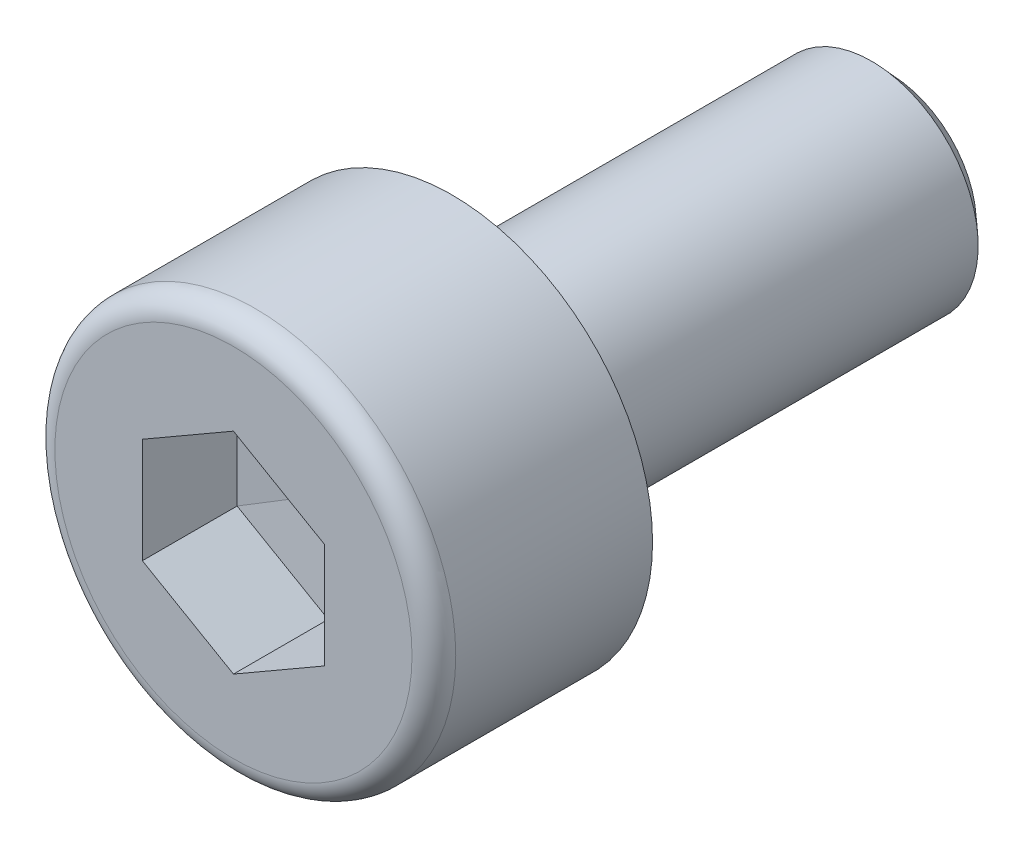
ISO-10303-21;
HEADER;
FILE_DESCRIPTION(('STEP AP214'),'2;1');
FILE_NAME('part.step','',(''),(''),'','','');
FILE_SCHEMA(('AUTOMOTIVE_DESIGN { 1 0 10303 214 1 1 1 1 }'));
ENDSEC;
DATA;
#1=APPLICATION_CONTEXT('core data for automotive mechanical design processes');
#2=APPLICATION_PROTOCOL_DEFINITION('international standard','automotive_design',2000,#1);
#3=PRODUCT_CONTEXT('',#1,'mechanical');
#4=PRODUCT('Part','Part','',(#3));
#5=PRODUCT_RELATED_PRODUCT_CATEGORY('part','',(#4));
#6=PRODUCT_DEFINITION_FORMATION('','',#4);
#7=PRODUCT_DEFINITION_CONTEXT('part definition',#1,'design');
#8=PRODUCT_DEFINITION('design','',#6,#7);
#9=PRODUCT_DEFINITION_SHAPE('','',#8);
#10=(LENGTH_UNIT() NAMED_UNIT(*) SI_UNIT(.MILLI.,.METRE.));
#11=(NAMED_UNIT(*) PLANE_ANGLE_UNIT() SI_UNIT($,.RADIAN.));
#12=(NAMED_UNIT(*) SI_UNIT($,.STERADIAN.) SOLID_ANGLE_UNIT());
#13=UNCERTAINTY_MEASURE_WITH_UNIT(LENGTH_MEASURE(1.E-05),#10,'distance_accuracy_value','');
#14=(GEOMETRIC_REPRESENTATION_CONTEXT(3) GLOBAL_UNCERTAINTY_ASSIGNED_CONTEXT((#13)) GLOBAL_UNIT_ASSIGNED_CONTEXT((#10,
#11,#12)) REPRESENTATION_CONTEXT('',''));
#15=CARTESIAN_POINT('',(0.,0.,0.));
#16=DIRECTION('',(0.,0.,1.));
#17=DIRECTION('',(1.,0.,0.));
#18=AXIS2_PLACEMENT_3D('',#15,#16,#17);
#19=CARTESIAN_POINT('',(-1.5,0.,-1.93470335983093E-13));
#20=DIRECTION('',(0.,0.,-1.));
#21=DIRECTION('',(0.,-1.,0.));
#22=AXIS2_PLACEMENT_3D('',#19,#20,#21);
#23=PLANE('',#22);
#24=CARTESIAN_POINT('',(0.,0.,-1.86517468137026E-13));
#25=DIRECTION('',(0.,0.,-1.));
#26=DIRECTION('',(-1.,0.,0.));
#27=AXIS2_PLACEMENT_3D('',#24,#25,#26);
#28=CIRCLE('',#27,1.4635);
#29=CARTESIAN_POINT('',(-1.46350000000002,0.,-1.93675477230026E-13));
#30=VERTEX_POINT('',#29);
#31=EDGE_CURVE('E11',#30,#30,#28,.T.);
#32=ORIENTED_EDGE('',*,*,#31,.F.);
#33=EDGE_LOOP('',(#32));
#34=FACE_BOUND('',#33,.T.);
#35=CARTESIAN_POINT('',(0.,0.,-3.46180666913291E-13));
#36=DIRECTION('',(0.,0.,-1.));
#37=DIRECTION('',(1.,0.,0.));
#38=AXIS2_PLACEMENT_3D('',#35,#36,#37);
#39=CIRCLE('',#38,2.75);
#40=CARTESIAN_POINT('',(2.74999999999998,0.,-3.33059281286552E-13));
#41=VERTEX_POINT('',#40);
#42=EDGE_CURVE('E116',#41,#41,#39,.T.);
#43=ORIENTED_EDGE('',*,*,#42,.T.);
#44=EDGE_LOOP('',(#43));
#45=FACE_BOUND('',#44,.T.);
#46=ADVANCED_FACE('F17',(#34,#45),#23,.T.);
#47=CARTESIAN_POINT('',(0.,0.,-6.));
#48=DIRECTION('',(0.,0.,-1.));
#49=DIRECTION('',(0.,-1.,0.));
#50=AXIS2_PLACEMENT_3D('',#47,#48,#49);
#51=PLANE('',#50);
#52=CARTESIAN_POINT('',(0.,0.,-6.));
#53=DIRECTION('',(0.,0.,-1.));
#54=DIRECTION('',(-1.,0.,0.));
#55=AXIS2_PLACEMENT_3D('',#52,#53,#54);
#56=CIRCLE('',#55,1.193275);
#57=CARTESIAN_POINT('',(-1.193275,0.,-6.));
#58=VERTEX_POINT('',#57);
#59=EDGE_CURVE('E277',#58,#58,#56,.T.);
#60=ORIENTED_EDGE('',*,*,#59,.T.);
#61=EDGE_LOOP('',(#60));
#62=FACE_BOUND('',#61,.T.);
#63=ADVANCED_FACE('F19',(#62),#51,.T.);
#64=CARTESIAN_POINT('',(0.,0.,-3.00000000000009));
#65=DIRECTION('',(0.,0.,-1.));
#66=DIRECTION('',(-1.,0.,0.));
#67=AXIS2_PLACEMENT_3D('',#64,#65,#66);
#68=CYLINDRICAL_SURFACE('',#67,1.4635);
#69=ORIENTED_EDGE('',*,*,#31,.T.);
#70=EDGE_LOOP('',(#69));
#71=FACE_BOUND('',#70,.T.);
#72=CARTESIAN_POINT('',(0.,0.,-5.75385028398561));
#73=DIRECTION('',(0.,0.,1.));
#74=DIRECTION('',(-1.,0.,0.));
#75=AXIS2_PLACEMENT_3D('',#72,#73,#74);
#76=CIRCLE('',#75,1.4635);
#77=CARTESIAN_POINT('',(-1.46349999999999,0.,-5.75385028398562));
#78=VERTEX_POINT('',#77);
#79=EDGE_CURVE('E283',#78,#78,#76,.T.);
#80=ORIENTED_EDGE('',*,*,#79,.T.);
#81=EDGE_LOOP('',(#80));
#82=FACE_BOUND('',#81,.T.);
#83=ADVANCED_FACE('F341',(#71,#82),#68,.T.);
#84=CARTESIAN_POINT('',(0.,-1.44337567297406,3.));
#85=DIRECTION('',(-0.5,-0.866025403784439,0.));
#86=DIRECTION('',(-0.866025403784439,0.5,0.));
#87=AXIS2_PLACEMENT_3D('',#84,#85,#86);
#88=PLANE('',#87);
#89=DIRECTION('',(-0.866025403784439,0.5,0.));
#90=VECTOR('',#89,1.);
#91=CARTESIAN_POINT('',(-1.34375,-0.667561248750502,2.99999999999965));
#92=LINE('',#91,#90);
#93=CARTESIAN_POINT('',(0.,-1.44337567297406,3.));
#94=VERTEX_POINT('',#93);
#95=CARTESIAN_POINT('',(-1.25,-0.721687836487032,3.));
#96=VERTEX_POINT('',#95);
#97=EDGE_CURVE('E142',#94,#96,#92,.T.);
#98=ORIENTED_EDGE('',*,*,#97,.F.);
#99=DIRECTION('',(0.,0.,-1.));
#100=VECTOR('',#99,1.);
#101=CARTESIAN_POINT('',(0.,-1.44337567297406,3.));
#102=LINE('',#101,#100);
#103=CARTESIAN_POINT('',(0.,-1.44337567297406,1.7));
#104=VERTEX_POINT('',#103);
#105=EDGE_CURVE('E106',#94,#104,#102,.T.);
#106=ORIENTED_EDGE('',*,*,#105,.T.);
#107=DIRECTION('',(-0.866025403784439,0.5,0.));
#108=VECTOR('',#107,1.);
#109=CARTESIAN_POINT('',(-1.25,-0.721687836487032,1.7));
#110=LINE('',#109,#108);
#111=CARTESIAN_POINT('',(-1.25,-0.721687836487032,1.7));
#112=VERTEX_POINT('',#111);
#113=EDGE_CURVE('E179',#104,#112,#110,.T.);
#114=ORIENTED_EDGE('',*,*,#113,.T.);
#115=DIRECTION('',(0.,0.,-1.));
#116=VECTOR('',#115,1.);
#117=CARTESIAN_POINT('',(-1.25,-0.721687836487032,3.));
#118=LINE('',#117,#116);
#119=EDGE_CURVE('E26',#96,#112,#118,.T.);
#120=ORIENTED_EDGE('',*,*,#119,.F.);
#121=EDGE_LOOP('',(#98,#106,#114,#120));
#122=FACE_BOUND('',#121,.T.);
#123=ADVANCED_FACE('F318',(#122),#88,.F.);
#124=CARTESIAN_POINT('',(-1.25,-0.721687836487032,3.));
#125=DIRECTION('',(-1.,0.,0.));
#126=DIRECTION('',(0.,0.,1.));
#127=AXIS2_PLACEMENT_3D('',#124,#125,#126);
#128=PLANE('',#127);
#129=DIRECTION('',(0.,1.,0.));
#130=VECTOR('',#129,1.);
#131=CARTESIAN_POINT('',(-1.25,-0.360843918243516,2.99999999999965));
#132=LINE('',#131,#130);
#133=CARTESIAN_POINT('',(-1.25,0.721687836487033,3.));
#134=VERTEX_POINT('',#133);
#135=EDGE_CURVE('E128',#96,#134,#132,.T.);
#136=ORIENTED_EDGE('',*,*,#135,.F.);
#137=ORIENTED_EDGE('',*,*,#119,.T.);
#138=DIRECTION('',(0.,1.,0.));
#139=VECTOR('',#138,1.);
#140=CARTESIAN_POINT('',(-1.25,0.721687836487033,1.7));
#141=LINE('',#140,#139);
#142=CARTESIAN_POINT('',(-1.25,0.721687836487033,1.7));
#143=VERTEX_POINT('',#142);
#144=EDGE_CURVE('E173',#112,#143,#141,.T.);
#145=ORIENTED_EDGE('',*,*,#144,.T.);
#146=DIRECTION('',(0.,0.,-1.));
#147=VECTOR('',#146,1.);
#148=CARTESIAN_POINT('',(-1.25,0.721687836487033,3.));
#149=LINE('',#148,#147);
#150=EDGE_CURVE('E47',#134,#143,#149,.T.);
#151=ORIENTED_EDGE('',*,*,#150,.F.);
#152=EDGE_LOOP('',(#136,#137,#145,#151));
#153=FACE_BOUND('',#152,.T.);
#154=ADVANCED_FACE('F296',(#153),#128,.F.);
#155=CARTESIAN_POINT('',(-1.25,0.721687836487033,3.));
#156=DIRECTION('',(-0.5,0.866025403784439,0.));
#157=DIRECTION('',(0.,0.,1.));
#158=AXIS2_PLACEMENT_3D('',#155,#156,#157);
#159=PLANE('',#158);
#160=DIRECTION('',(0.866025403784439,0.5,0.));
#161=VECTOR('',#160,1.);
#162=CARTESIAN_POINT('',(-1.96875,0.306717330506986,2.99999999999964));
#163=LINE('',#162,#161);
#164=CARTESIAN_POINT('',(0.,1.44337567297406,3.));
#165=VERTEX_POINT('',#164);
#166=EDGE_CURVE('E121',#134,#165,#163,.T.);
#167=ORIENTED_EDGE('',*,*,#166,.F.);
#168=ORIENTED_EDGE('',*,*,#150,.T.);
#169=DIRECTION('',(0.866025403784439,0.5,0.));
#170=VECTOR('',#169,1.);
#171=CARTESIAN_POINT('',(0.,1.44337567297406,1.7));
#172=LINE('',#171,#170);
#173=CARTESIAN_POINT('',(0.,1.44337567297406,1.7));
#174=VERTEX_POINT('',#173);
#175=EDGE_CURVE('E166',#143,#174,#172,.T.);
#176=ORIENTED_EDGE('',*,*,#175,.T.);
#177=DIRECTION('',(0.,0.,-1.));
#178=VECTOR('',#177,1.);
#179=CARTESIAN_POINT('',(0.,1.44337567297406,3.));
#180=LINE('',#179,#178);
#181=EDGE_CURVE('E105',#165,#174,#180,.T.);
#182=ORIENTED_EDGE('',*,*,#181,.F.);
#183=EDGE_LOOP('',(#167,#168,#176,#182));
#184=FACE_BOUND('',#183,.T.);
#185=ADVANCED_FACE('F299',(#184),#159,.F.);
#186=CARTESIAN_POINT('',(0.,1.44337567297406,3.));
#187=DIRECTION('',(0.5,0.866025403784439,0.));
#188=DIRECTION('',(0.,0.,-1.));
#189=AXIS2_PLACEMENT_3D('',#186,#187,#188);
#190=PLANE('',#189);
#191=DIRECTION('',(0.866025403784439,-0.5,0.));
#192=VECTOR('',#191,1.);
#193=CARTESIAN_POINT('',(-0.71875,1.85834617895411,2.99999999999965));
#194=LINE('',#193,#192);
#195=CARTESIAN_POINT('',(1.25,0.721687836487032,3.));
#196=VERTEX_POINT('',#195);
#197=EDGE_CURVE('E97',#165,#196,#194,.T.);
#198=ORIENTED_EDGE('',*,*,#197,.F.);
#199=ORIENTED_EDGE('',*,*,#181,.T.);
#200=DIRECTION('',(0.866025403784439,-0.5,0.));
#201=VECTOR('',#200,1.);
#202=CARTESIAN_POINT('',(1.25,0.721687836487032,1.7));
#203=LINE('',#202,#201);
#204=CARTESIAN_POINT('',(1.25,0.721687836487032,1.7));
#205=VERTEX_POINT('',#204);
#206=EDGE_CURVE('E100',#174,#205,#203,.T.);
#207=ORIENTED_EDGE('',*,*,#206,.T.);
#208=DIRECTION('',(0.,0.,-1.));
#209=VECTOR('',#208,1.);
#210=CARTESIAN_POINT('',(1.25,0.721687836487032,3.));
#211=LINE('',#210,#209);
#212=EDGE_CURVE('E93',#196,#205,#211,.T.);
#213=ORIENTED_EDGE('',*,*,#212,.F.);
#214=EDGE_LOOP('',(#198,#199,#207,#213));
#215=FACE_BOUND('',#214,.T.);
#216=ADVANCED_FACE('F95',(#215),#190,.F.);
#217=CARTESIAN_POINT('',(1.25,0.721687836487032,3.));
#218=DIRECTION('',(1.,0.,0.));
#219=DIRECTION('',(0.,1.,0.));
#220=AXIS2_PLACEMENT_3D('',#217,#218,#219);
#221=PLANE('',#220);
#222=DIRECTION('',(0.,-1.,0.));
#223=VECTOR('',#222,1.);
#224=CARTESIAN_POINT('',(1.25,0.360843918243516,2.99999999999966));
#225=LINE('',#224,#223);
#226=CARTESIAN_POINT('',(1.25,-0.721687836487032,3.));
#227=VERTEX_POINT('',#226);
#228=EDGE_CURVE('E109',#196,#227,#225,.T.);
#229=ORIENTED_EDGE('',*,*,#228,.F.);
#230=ORIENTED_EDGE('',*,*,#212,.T.);
#231=DIRECTION('',(0.,-1.,0.));
#232=VECTOR('',#231,1.);
#233=CARTESIAN_POINT('',(1.25,-0.721687836487032,1.7));
#234=LINE('',#233,#232);
#235=CARTESIAN_POINT('',(1.25,-0.721687836487032,1.7));
#236=VERTEX_POINT('',#235);
#237=EDGE_CURVE('E153',#205,#236,#234,.T.);
#238=ORIENTED_EDGE('',*,*,#237,.T.);
#239=DIRECTION('',(0.,0.,-1.));
#240=VECTOR('',#239,1.);
#241=CARTESIAN_POINT('',(1.25,-0.721687836487032,3.));
#242=LINE('',#241,#240);
#243=EDGE_CURVE('E111',#227,#236,#242,.T.);
#244=ORIENTED_EDGE('',*,*,#243,.F.);
#245=EDGE_LOOP('',(#229,#230,#238,#244));
#246=FACE_BOUND('',#245,.T.);
#247=ADVANCED_FACE('F110',(#246),#221,.F.);
#248=CARTESIAN_POINT('',(1.25,-0.721687836487032,3.));
#249=DIRECTION('',(0.5,-0.866025403784439,0.));
#250=DIRECTION('',(0.,0.,-1.));
#251=AXIS2_PLACEMENT_3D('',#248,#249,#250);
#252=PLANE('',#251);
#253=DIRECTION('',(-0.866025403784439,-0.5,0.));
#254=VECTOR('',#253,1.);
#255=CARTESIAN_POINT('',(-0.0937500000000048,-1.4975022607106,2.99999999999965));
#256=LINE('',#255,#254);
#257=EDGE_CURVE('E140',#227,#94,#256,.T.);
#258=ORIENTED_EDGE('',*,*,#257,.F.);
#259=ORIENTED_EDGE('',*,*,#243,.T.);
#260=DIRECTION('',(-0.866025403784439,-0.5,0.));
#261=VECTOR('',#260,1.);
#262=CARTESIAN_POINT('',(0.,-1.44337567297406,1.7));
#263=LINE('',#262,#261);
#264=EDGE_CURVE('E134',#236,#104,#263,.T.);
#265=ORIENTED_EDGE('',*,*,#264,.T.);
#266=ORIENTED_EDGE('',*,*,#105,.F.);
#267=EDGE_LOOP('',(#258,#259,#265,#266));
#268=FACE_BOUND('',#267,.T.);
#269=ADVANCED_FACE('F315',(#268),#252,.F.);
#270=CARTESIAN_POINT('',(-1.25,-0.721687836487032,1.7));
#271=DIRECTION('',(-0.043577871373829,-0.0754790873051733,-0.996194698091746));
#272=DIRECTION('',(0.,-0.997141949694317,0.0755508581011305));
#273=AXIS2_PLACEMENT_3D('',#270,#271,#272);
#274=PLANE('',#273);
#275=DIRECTION('',(0.863550259614423,0.498570974847158,-0.0755508581011305));
#276=VECTOR('',#275,1.);
#277=CARTESIAN_POINT('',(-0.939283728799944,-0.542295713668081,1.67281584869695));
#278=LINE('',#277,#276);
#279=CARTESIAN_POINT('',(0.,0.,1.5906391705926));
#280=VERTEX_POINT('',#279);
#281=EDGE_CURVE('E176',#112,#280,#278,.T.);
#282=ORIENTED_EDGE('',*,*,#281,.F.);
#283=ORIENTED_EDGE('',*,*,#113,.F.);
#284=DIRECTION('',(0.,0.997141949694317,-0.0755508581011306));
#285=VECTOR('',#284,1.);
#286=CARTESIAN_POINT('',(0.,-1.08459142733616,1.67281584869695));
#287=LINE('',#286,#285);
#288=EDGE_CURVE('E139',#104,#280,#287,.T.);
#289=ORIENTED_EDGE('',*,*,#288,.T.);
#290=EDGE_LOOP('',(#282,#283,#289));
#291=FACE_BOUND('',#290,.T.);
#292=ADVANCED_FACE('F321',(#291),#274,.F.);
#293=CARTESIAN_POINT('',(-1.25,0.721687836487033,1.7));
#294=DIRECTION('',(-0.0871557427476581,0.,-0.996194698091746));
#295=DIRECTION('',(-0.996194698091746,0.,0.0871557427476581));
#296=AXIS2_PLACEMENT_3D('',#293,#294,#295);
#297=PLANE('',#296);
#298=DIRECTION('',(0.863550259614423,-0.498570974847159,-0.0755508581011305));
#299=VECTOR('',#298,1.);
#300=CARTESIAN_POINT('',(-0.939283728799943,0.542295713668083,1.67281584869695));
#301=LINE('',#300,#299);
#302=EDGE_CURVE('E169',#143,#280,#301,.T.);
#303=ORIENTED_EDGE('',*,*,#302,.F.);
#304=ORIENTED_EDGE('',*,*,#144,.F.);
#305=ORIENTED_EDGE('',*,*,#281,.T.);
#306=EDGE_LOOP('',(#303,#304,#305));
#307=FACE_BOUND('',#306,.T.);
#308=ADVANCED_FACE('F323',(#307),#297,.F.);
#309=CARTESIAN_POINT('',(0.,1.44337567297406,1.7));
#310=DIRECTION('',(-0.043577871373829,0.0754790873051733,-0.996194698091746));
#311=DIRECTION('',(-0.999044587684655,0.,0.043702537889669));
#312=AXIS2_PLACEMENT_3D('',#309,#310,#311);
#313=PLANE('',#312);
#314=DIRECTION('',(0.,-0.997141949694317,-0.0755508581011306));
#315=VECTOR('',#314,1.);
#316=CARTESIAN_POINT('',(0.,1.08459142733616,1.67281584869695));
#317=LINE('',#316,#315);
#318=EDGE_CURVE('E162',#174,#280,#317,.T.);
#319=ORIENTED_EDGE('',*,*,#318,.F.);
#320=ORIENTED_EDGE('',*,*,#175,.F.);
#321=ORIENTED_EDGE('',*,*,#302,.T.);
#322=EDGE_LOOP('',(#319,#320,#321));
#323=FACE_BOUND('',#322,.T.);
#324=ADVANCED_FACE('F303',(#323),#313,.F.);
#325=CARTESIAN_POINT('',(1.25,0.721687836487032,1.7));
#326=DIRECTION('',(0.0435778713738291,0.0754790873051733,-0.996194698091746));
#327=DIRECTION('',(-0.999044587684655,0.,-0.0437025378896691));
#328=AXIS2_PLACEMENT_3D('',#325,#326,#327);
#329=PLANE('',#328);
#330=DIRECTION('',(-0.863550259614423,-0.498570974847158,-0.0755508581011305));
#331=VECTOR('',#330,1.);
#332=CARTESIAN_POINT('',(0.939283728799944,0.542295713668082,1.67281584869695));
#333=LINE('',#332,#331);
#334=EDGE_CURVE('E156',#205,#280,#333,.T.);
#335=ORIENTED_EDGE('',*,*,#334,.F.);
#336=ORIENTED_EDGE('',*,*,#206,.F.);
#337=ORIENTED_EDGE('',*,*,#318,.T.);
#338=EDGE_LOOP('',(#335,#336,#337));
#339=FACE_BOUND('',#338,.T.);
#340=ADVANCED_FACE('F305',(#339),#329,.F.);
#341=CARTESIAN_POINT('',(1.25,-0.721687836487032,1.7));
#342=DIRECTION('',(0.0871557427476581,0.,-0.996194698091746));
#343=DIRECTION('',(0.,-1.,0.));
#344=AXIS2_PLACEMENT_3D('',#341,#342,#343);
#345=PLANE('',#344);
#346=DIRECTION('',(-0.863550259614423,0.498570974847158,-0.0755508581011305));
#347=VECTOR('',#346,1.);
#348=CARTESIAN_POINT('',(0.939283728799943,-0.542295713668083,1.67281584869695));
#349=LINE('',#348,#347);
#350=EDGE_CURVE('E138',#236,#280,#349,.T.);
#351=ORIENTED_EDGE('',*,*,#350,.F.);
#352=ORIENTED_EDGE('',*,*,#237,.F.);
#353=ORIENTED_EDGE('',*,*,#334,.T.);
#354=EDGE_LOOP('',(#351,#352,#353));
#355=FACE_BOUND('',#354,.T.);
#356=ADVANCED_FACE('F309',(#355),#345,.F.);
#357=CARTESIAN_POINT('',(0.,-1.44337567297406,1.7));
#358=DIRECTION('',(0.0435778713738291,-0.0754790873051733,-0.996194698091746));
#359=DIRECTION('',(0.,-0.997141949694317,0.0755508581011305));
#360=AXIS2_PLACEMENT_3D('',#357,#358,#359);
#361=PLANE('',#360);
#362=ORIENTED_EDGE('',*,*,#288,.F.);
#363=ORIENTED_EDGE('',*,*,#264,.F.);
#364=ORIENTED_EDGE('',*,*,#350,.T.);
#365=EDGE_LOOP('',(#362,#363,#364));
#366=FACE_BOUND('',#365,.T.);
#367=ADVANCED_FACE('F313',(#366),#361,.F.);
#368=CARTESIAN_POINT('',(0.,0.,1.49999999999965));
#369=DIRECTION('',(0.,0.,-1.));
#370=DIRECTION('',(-1.,0.,0.));
#371=AXIS2_PLACEMENT_3D('',#368,#369,#370);
#372=CYLINDRICAL_SURFACE('',#371,2.75);
#373=CARTESIAN_POINT('',(0.,0.,2.69999999999965));
#374=DIRECTION('',(0.,0.,1.));
#375=DIRECTION('',(1.,0.,0.));
#376=AXIS2_PLACEMENT_3D('',#373,#374,#375);
#377=CIRCLE('',#376,2.75);
#378=CARTESIAN_POINT('',(2.74999999999996,0.,2.69999999999966));
#379=VERTEX_POINT('',#378);
#380=EDGE_CURVE('E271',#379,#379,#377,.T.);
#381=ORIENTED_EDGE('',*,*,#380,.F.);
#382=EDGE_LOOP('',(#381));
#383=FACE_BOUND('',#382,.T.);
#384=ORIENTED_EDGE('',*,*,#42,.F.);
#385=EDGE_LOOP('',(#384));
#386=FACE_BOUND('',#385,.T.);
#387=ADVANCED_FACE('F382',(#383,#386),#372,.T.);
#388=CARTESIAN_POINT('',(-2.75,0.,2.99999999999964));
#389=DIRECTION('',(0.,0.,1.));
#390=DIRECTION('',(1.,0.,0.));
#391=AXIS2_PLACEMENT_3D('',#388,#389,#390);
#392=PLANE('',#391);
#393=ORIENTED_EDGE('',*,*,#257,.T.);
#394=ORIENTED_EDGE('',*,*,#97,.T.);
#395=ORIENTED_EDGE('',*,*,#135,.T.);
#396=ORIENTED_EDGE('',*,*,#166,.T.);
#397=ORIENTED_EDGE('',*,*,#197,.T.);
#398=ORIENTED_EDGE('',*,*,#228,.T.);
#399=EDGE_LOOP('',(#393,#394,#395,#396,#397,#398));
#400=FACE_BOUND('',#399,.T.);
#401=CARTESIAN_POINT('',(0.,0.,2.99999999999965));
#402=DIRECTION('',(0.,0.,-1.));
#403=DIRECTION('',(1.,0.,0.));
#404=AXIS2_PLACEMENT_3D('',#401,#402,#403);
#405=CIRCLE('',#404,2.45);
#406=CARTESIAN_POINT('',(2.44999999999996,0.,2.99999999999966));
#407=VERTEX_POINT('',#406);
#408=EDGE_CURVE('E131',#407,#407,#405,.T.);
#409=ORIENTED_EDGE('',*,*,#408,.F.);
#410=EDGE_LOOP('',(#409));
#411=FACE_BOUND('',#410,.T.);
#412=ADVANCED_FACE('F118',(#400,#411),#392,.T.);
#413=CARTESIAN_POINT('',(0.,0.,2.69999999999965));
#414=DIRECTION('',(0.,0.,-1.));
#415=DIRECTION('',(-1.,0.,0.));
#416=AXIS2_PLACEMENT_3D('',#413,#414,#415);
#417=TOROIDAL_SURFACE('',#416,2.45,0.3);
#418=ORIENTED_EDGE('',*,*,#408,.T.);
#419=EDGE_LOOP('',(#418));
#420=FACE_BOUND('',#419,.T.);
#421=ORIENTED_EDGE('',*,*,#380,.T.);
#422=EDGE_LOOP('',(#421));
#423=FACE_BOUND('',#422,.T.);
#424=ADVANCED_FACE('F370',(#420,#423),#417,.T.);
#425=CARTESIAN_POINT('',(0.,0.,-5.8466375));
#426=DIRECTION('',(0.,0.,1.));
#427=DIRECTION('',(-1.,0.,0.));
#428=AXIS2_PLACEMENT_3D('',#425,#426,#427);
#429=CONICAL_SURFACE('',#428,1.3616375000001,0.831988093683349);
#430=ORIENTED_EDGE('',*,*,#59,.F.);
#431=EDGE_LOOP('',(#430));
#432=FACE_BOUND('',#431,.T.);
#433=ORIENTED_EDGE('',*,*,#79,.F.);
#434=EDGE_LOOP('',(#433));
#435=FACE_BOUND('',#434,.T.);
#436=ADVANCED_FACE('F368',(#432,#435),#429,.T.);
#437=CLOSED_SHELL('',(#46,#63,#83,#123,#154,#185,#216,#247,#269,#292,#308,#324,#340,#356,#367,
#387,#412,#424,#436));
#438=MANIFOLD_SOLID_BREP('B1',#437);
#439=ADVANCED_BREP_SHAPE_REPRESENTATION('',(#18,#438),#14);
#440=SHAPE_DEFINITION_REPRESENTATION(#9,#439);
ENDSEC;
END-ISO-10303-21;
